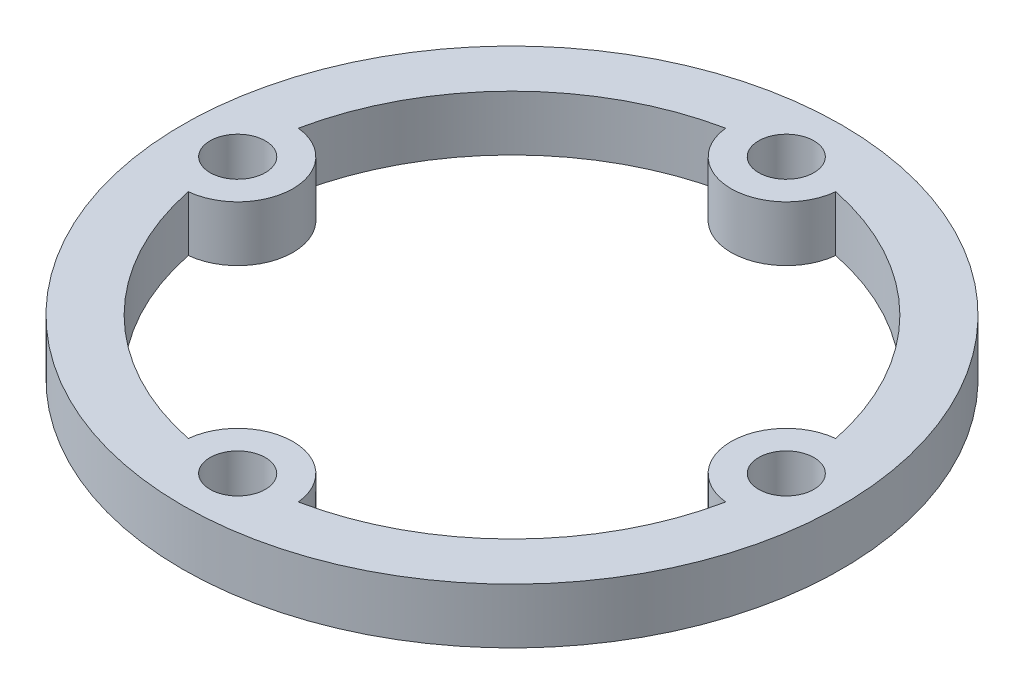
ISO-10303-21;
HEADER;
FILE_DESCRIPTION(('STEP AP214'),'2;1');
FILE_NAME('part.step','',(''),(''),'','','');
FILE_SCHEMA(('AUTOMOTIVE_DESIGN { 1 0 10303 214 1 1 1 1 }'));
ENDSEC;
DATA;
#1=APPLICATION_CONTEXT('core data for automotive mechanical design processes');
#2=APPLICATION_PROTOCOL_DEFINITION('international standard','automotive_design',2000,#1);
#3=PRODUCT_CONTEXT('',#1,'mechanical');
#4=PRODUCT('Part','Part','',(#3));
#5=PRODUCT_RELATED_PRODUCT_CATEGORY('part','',(#4));
#6=PRODUCT_DEFINITION_FORMATION('','',#4);
#7=PRODUCT_DEFINITION_CONTEXT('part definition',#1,'design');
#8=PRODUCT_DEFINITION('design','',#6,#7);
#9=PRODUCT_DEFINITION_SHAPE('','',#8);
#10=(LENGTH_UNIT() NAMED_UNIT(*) SI_UNIT(.MILLI.,.METRE.));
#11=(NAMED_UNIT(*) PLANE_ANGLE_UNIT() SI_UNIT($,.RADIAN.));
#12=(NAMED_UNIT(*) SI_UNIT($,.STERADIAN.) SOLID_ANGLE_UNIT());
#13=UNCERTAINTY_MEASURE_WITH_UNIT(LENGTH_MEASURE(1.E-05),#10,'distance_accuracy_value','');
#14=(GEOMETRIC_REPRESENTATION_CONTEXT(3) GLOBAL_UNCERTAINTY_ASSIGNED_CONTEXT((#13)) GLOBAL_UNIT_ASSIGNED_CONTEXT((#10,
#11,#12)) REPRESENTATION_CONTEXT('',''));
#15=CARTESIAN_POINT('',(0.,0.,0.));
#16=DIRECTION('',(0.,0.,1.));
#17=DIRECTION('',(1.,0.,0.));
#18=AXIS2_PLACEMENT_3D('',#15,#16,#17);
#19=CARTESIAN_POINT('',(0.,2.,-9.925));
#20=DIRECTION('',(0.,-1.,0.));
#21=DIRECTION('',(0.,0.,-1.));
#22=AXIS2_PLACEMENT_3D('',#19,#20,#21);
#23=CYLINDRICAL_SURFACE('',#22,2.);
#24=CARTESIAN_POINT('',(0.,0.,-9.925));
#25=DIRECTION('',(0.,1.,0.));
#26=DIRECTION('',(0.,0.,1.));
#27=AXIS2_PLACEMENT_3D('',#24,#25,#26);
#28=CIRCLE('',#27,2.);
#29=CARTESIAN_POINT('',(-1.98982239957777,0.,-9.72348866498741));
#30=VERTEX_POINT('',#29);
#31=CARTESIAN_POINT('',(1.98982239957777,0.,-9.72348866498741));
#32=VERTEX_POINT('',#31);
#33=EDGE_CURVE('E170',#30,#32,#28,.T.);
#34=ORIENTED_EDGE('',*,*,#33,.T.);
#35=DIRECTION('',(0.,-1.,0.));
#36=VECTOR('',#35,1.);
#37=CARTESIAN_POINT('',(1.98982239957777,2.,-9.72348866498741));
#38=LINE('',#37,#36);
#39=CARTESIAN_POINT('',(1.98982239957777,2.,-9.72348866498741));
#40=VERTEX_POINT('',#39);
#41=EDGE_CURVE('E11',#40,#32,#38,.T.);
#42=ORIENTED_EDGE('',*,*,#41,.F.);
#43=CARTESIAN_POINT('',(0.,2.,-9.925));
#44=DIRECTION('',(0.,1.,0.));
#45=DIRECTION('',(0.,0.,1.));
#46=AXIS2_PLACEMENT_3D('',#43,#44,#45);
#47=CIRCLE('',#46,2.);
#48=CARTESIAN_POINT('',(-1.98982239957777,2.,-9.72348866498741));
#49=VERTEX_POINT('',#48);
#50=EDGE_CURVE('E101',#49,#40,#47,.T.);
#51=ORIENTED_EDGE('',*,*,#50,.F.);
#52=DIRECTION('',(0.,-1.,0.));
#53=VECTOR('',#52,1.);
#54=CARTESIAN_POINT('',(-1.98982239957777,2.,-9.72348866498741));
#55=LINE('',#54,#53);
#56=EDGE_CURVE('E63',#49,#30,#55,.T.);
#57=ORIENTED_EDGE('',*,*,#56,.T.);
#58=EDGE_LOOP('',(#34,#42,#51,#57));
#59=FACE_BOUND('',#58,.T.);
#60=ADVANCED_FACE('F45',(#59),#23,.T.);
#61=CARTESIAN_POINT('',(0.,2.,0.));
#62=DIRECTION('',(0.,-1.,0.));
#63=DIRECTION('',(0.,0.,-1.));
#64=AXIS2_PLACEMENT_3D('',#61,#62,#63);
#65=CYLINDRICAL_SURFACE('',#64,9.925);
#66=CARTESIAN_POINT('',(0.,0.,0.));
#67=DIRECTION('',(0.,1.,0.));
#68=DIRECTION('',(0.,0.,1.));
#69=AXIS2_PLACEMENT_3D('',#66,#67,#68);
#70=CIRCLE('',#69,9.925);
#71=CARTESIAN_POINT('',(9.72348866498741,0.,-1.98982239957773));
#72=VERTEX_POINT('',#71);
#73=EDGE_CURVE('E173',#72,#32,#70,.T.);
#74=ORIENTED_EDGE('',*,*,#73,.F.);
#75=DIRECTION('',(0.,-1.,0.));
#76=VECTOR('',#75,1.);
#77=CARTESIAN_POINT('',(9.72348866498741,2.,-1.98982239957773));
#78=LINE('',#77,#76);
#79=CARTESIAN_POINT('',(9.72348866498741,2.,-1.98982239957773));
#80=VERTEX_POINT('',#79);
#81=EDGE_CURVE('E55',#80,#72,#78,.T.);
#82=ORIENTED_EDGE('',*,*,#81,.F.);
#83=CARTESIAN_POINT('',(0.,2.,0.));
#84=DIRECTION('',(0.,1.,0.));
#85=DIRECTION('',(0.,0.,1.));
#86=AXIS2_PLACEMENT_3D('',#83,#84,#85);
#87=CIRCLE('',#86,9.925);
#88=EDGE_CURVE('E238',#80,#40,#87,.T.);
#89=ORIENTED_EDGE('',*,*,#88,.T.);
#90=ORIENTED_EDGE('',*,*,#41,.T.);
#91=EDGE_LOOP('',(#74,#82,#89,#90));
#92=FACE_BOUND('',#91,.T.);
#93=ADVANCED_FACE('F237',(#92),#65,.F.);
#94=CARTESIAN_POINT('',(9.925,2.,0.));
#95=DIRECTION('',(0.,-1.,0.));
#96=DIRECTION('',(0.,0.,-1.));
#97=AXIS2_PLACEMENT_3D('',#94,#95,#96);
#98=CYLINDRICAL_SURFACE('',#97,2.);
#99=CARTESIAN_POINT('',(9.925,0.,0.));
#100=DIRECTION('',(0.,1.,0.));
#101=DIRECTION('',(0.,0.,1.));
#102=AXIS2_PLACEMENT_3D('',#99,#100,#101);
#103=CIRCLE('',#102,2.);
#104=CARTESIAN_POINT('',(9.7234886649874,0.,1.9898223995778));
#105=VERTEX_POINT('',#104);
#106=EDGE_CURVE('E177',#72,#105,#103,.T.);
#107=ORIENTED_EDGE('',*,*,#106,.T.);
#108=DIRECTION('',(0.,-1.,0.));
#109=VECTOR('',#108,1.);
#110=CARTESIAN_POINT('',(9.7234886649874,2.,1.9898223995778));
#111=LINE('',#110,#109);
#112=CARTESIAN_POINT('',(9.7234886649874,2.,1.9898223995778));
#113=VERTEX_POINT('',#112);
#114=EDGE_CURVE('E220',#113,#105,#111,.T.);
#115=ORIENTED_EDGE('',*,*,#114,.F.);
#116=CARTESIAN_POINT('',(9.925,2.,0.));
#117=DIRECTION('',(0.,1.,0.));
#118=DIRECTION('',(0.,0.,1.));
#119=AXIS2_PLACEMENT_3D('',#116,#117,#118);
#120=CIRCLE('',#119,2.);
#121=EDGE_CURVE('E228',#80,#113,#120,.T.);
#122=ORIENTED_EDGE('',*,*,#121,.F.);
#123=ORIENTED_EDGE('',*,*,#81,.T.);
#124=EDGE_LOOP('',(#107,#115,#122,#123));
#125=FACE_BOUND('',#124,.T.);
#126=ADVANCED_FACE('F226',(#125),#98,.T.);
#127=CARTESIAN_POINT('',(0.,2.,0.));
#128=DIRECTION('',(0.,-1.,0.));
#129=DIRECTION('',(0.,0.,-1.));
#130=AXIS2_PLACEMENT_3D('',#127,#128,#129);
#131=CYLINDRICAL_SURFACE('',#130,9.925);
#132=CARTESIAN_POINT('',(0.,0.,0.));
#133=DIRECTION('',(0.,1.,0.));
#134=DIRECTION('',(0.,0.,1.));
#135=AXIS2_PLACEMENT_3D('',#132,#133,#134);
#136=CIRCLE('',#135,9.925);
#137=CARTESIAN_POINT('',(1.9898223995777,0.,9.72348866498742));
#138=VERTEX_POINT('',#137);
#139=EDGE_CURVE('E181',#138,#105,#136,.T.);
#140=ORIENTED_EDGE('',*,*,#139,.F.);
#141=DIRECTION('',(0.,-1.,0.));
#142=VECTOR('',#141,1.);
#143=CARTESIAN_POINT('',(1.9898223995777,2.,9.72348866498742));
#144=LINE('',#143,#142);
#145=CARTESIAN_POINT('',(1.9898223995777,2.,9.72348866498742));
#146=VERTEX_POINT('',#145);
#147=EDGE_CURVE('E217',#146,#138,#144,.T.);
#148=ORIENTED_EDGE('',*,*,#147,.F.);
#149=CARTESIAN_POINT('',(0.,2.,0.));
#150=DIRECTION('',(0.,1.,0.));
#151=DIRECTION('',(0.,0.,1.));
#152=AXIS2_PLACEMENT_3D('',#149,#150,#151);
#153=CIRCLE('',#152,9.925);
#154=EDGE_CURVE('E144',#146,#113,#153,.T.);
#155=ORIENTED_EDGE('',*,*,#154,.T.);
#156=ORIENTED_EDGE('',*,*,#114,.T.);
#157=EDGE_LOOP('',(#140,#148,#155,#156));
#158=FACE_BOUND('',#157,.T.);
#159=ADVANCED_FACE('F262',(#158),#131,.F.);
#160=CARTESIAN_POINT('',(0.,2.,9.925));
#161=DIRECTION('',(0.,-1.,0.));
#162=DIRECTION('',(0.,0.,-1.));
#163=AXIS2_PLACEMENT_3D('',#160,#161,#162);
#164=CYLINDRICAL_SURFACE('',#163,2.);
#165=CARTESIAN_POINT('',(0.,0.,9.925));
#166=DIRECTION('',(0.,1.,0.));
#167=DIRECTION('',(0.,0.,1.));
#168=AXIS2_PLACEMENT_3D('',#165,#166,#167);
#169=CIRCLE('',#168,2.);
#170=CARTESIAN_POINT('',(-1.98982239957784,0.,9.72348866498739));
#171=VERTEX_POINT('',#170);
#172=EDGE_CURVE('E185',#138,#171,#169,.T.);
#173=ORIENTED_EDGE('',*,*,#172,.T.);
#174=DIRECTION('',(0.,-1.,0.));
#175=VECTOR('',#174,1.);
#176=CARTESIAN_POINT('',(-1.98982239957784,2.,9.72348866498739));
#177=LINE('',#176,#175);
#178=CARTESIAN_POINT('',(-1.98982239957784,2.,9.72348866498739));
#179=VERTEX_POINT('',#178);
#180=EDGE_CURVE('E128',#179,#171,#177,.T.);
#181=ORIENTED_EDGE('',*,*,#180,.F.);
#182=CARTESIAN_POINT('',(0.,2.,9.925));
#183=DIRECTION('',(0.,1.,0.));
#184=DIRECTION('',(0.,0.,1.));
#185=AXIS2_PLACEMENT_3D('',#182,#183,#184);
#186=CIRCLE('',#185,2.);
#187=EDGE_CURVE('E139',#146,#179,#186,.T.);
#188=ORIENTED_EDGE('',*,*,#187,.F.);
#189=ORIENTED_EDGE('',*,*,#147,.T.);
#190=EDGE_LOOP('',(#173,#181,#188,#189));
#191=FACE_BOUND('',#190,.T.);
#192=ADVANCED_FACE('F265',(#191),#164,.T.);
#193=CARTESIAN_POINT('',(0.,2.,0.));
#194=DIRECTION('',(0.,-1.,0.));
#195=DIRECTION('',(0.,0.,-1.));
#196=AXIS2_PLACEMENT_3D('',#193,#194,#195);
#197=CYLINDRICAL_SURFACE('',#196,9.925);
#198=CARTESIAN_POINT('',(0.,0.,0.));
#199=DIRECTION('',(0.,1.,0.));
#200=DIRECTION('',(0.,0.,1.));
#201=AXIS2_PLACEMENT_3D('',#198,#199,#200);
#202=CIRCLE('',#201,9.925);
#203=CARTESIAN_POINT('',(-9.72348866498743,0.,1.98982239957767));
#204=VERTEX_POINT('',#203);
#205=EDGE_CURVE('E124',#204,#171,#202,.T.);
#206=ORIENTED_EDGE('',*,*,#205,.F.);
#207=DIRECTION('',(0.,-1.,0.));
#208=VECTOR('',#207,1.);
#209=CARTESIAN_POINT('',(-9.72348866498743,2.,1.98982239957767));
#210=LINE('',#209,#208);
#211=CARTESIAN_POINT('',(-9.72348866498743,2.,1.98982239957767));
#212=VERTEX_POINT('',#211);
#213=EDGE_CURVE('E118',#212,#204,#210,.T.);
#214=ORIENTED_EDGE('',*,*,#213,.F.);
#215=CARTESIAN_POINT('',(0.,2.,0.));
#216=DIRECTION('',(0.,1.,0.));
#217=DIRECTION('',(0.,0.,1.));
#218=AXIS2_PLACEMENT_3D('',#215,#216,#217);
#219=CIRCLE('',#218,9.925);
#220=EDGE_CURVE('E122',#212,#179,#219,.T.);
#221=ORIENTED_EDGE('',*,*,#220,.T.);
#222=ORIENTED_EDGE('',*,*,#180,.T.);
#223=EDGE_LOOP('',(#206,#214,#221,#222));
#224=FACE_BOUND('',#223,.T.);
#225=ADVANCED_FACE('F120',(#224),#197,.F.);
#226=CARTESIAN_POINT('',(-9.925,2.,-1.03958856864054E-13));
#227=DIRECTION('',(0.,-1.,0.));
#228=DIRECTION('',(0.,0.,-1.));
#229=AXIS2_PLACEMENT_3D('',#226,#227,#228);
#230=CYLINDRICAL_SURFACE('',#229,2.);
#231=CARTESIAN_POINT('',(-9.925,0.,-1.03958856864054E-13));
#232=DIRECTION('',(0.,1.,0.));
#233=DIRECTION('',(0.,0.,1.));
#234=AXIS2_PLACEMENT_3D('',#231,#232,#233);
#235=CIRCLE('',#234,2.);
#236=CARTESIAN_POINT('',(-9.72348866498739,0.,-1.98982239957787));
#237=VERTEX_POINT('',#236);
#238=EDGE_CURVE('E191',#204,#237,#235,.T.);
#239=ORIENTED_EDGE('',*,*,#238,.T.);
#240=DIRECTION('',(0.,-1.,0.));
#241=VECTOR('',#240,1.);
#242=CARTESIAN_POINT('',(-9.72348866498739,2.,-1.98982239957787));
#243=LINE('',#242,#241);
#244=CARTESIAN_POINT('',(-9.72348866498739,2.,-1.98982239957787));
#245=VERTEX_POINT('',#244);
#246=EDGE_CURVE('E89',#245,#237,#243,.T.);
#247=ORIENTED_EDGE('',*,*,#246,.F.);
#248=CARTESIAN_POINT('',(-9.925,2.,-1.03958856864054E-13));
#249=DIRECTION('',(0.,1.,0.));
#250=DIRECTION('',(0.,0.,1.));
#251=AXIS2_PLACEMENT_3D('',#248,#249,#250);
#252=CIRCLE('',#251,2.);
#253=EDGE_CURVE('E130',#212,#245,#252,.T.);
#254=ORIENTED_EDGE('',*,*,#253,.F.);
#255=ORIENTED_EDGE('',*,*,#213,.T.);
#256=EDGE_LOOP('',(#239,#247,#254,#255));
#257=FACE_BOUND('',#256,.T.);
#258=ADVANCED_FACE('F131',(#257),#230,.T.);
#259=CARTESIAN_POINT('',(9.925,2.,0.));
#260=DIRECTION('',(0.,-1.,0.));
#261=DIRECTION('',(0.,0.,-1.));
#262=AXIS2_PLACEMENT_3D('',#259,#260,#261);
#263=CYLINDRICAL_SURFACE('',#262,1.);
#264=CARTESIAN_POINT('',(9.925,2.,0.));
#265=DIRECTION('',(0.,1.,0.));
#266=DIRECTION('',(0.,0.,1.));
#267=AXIS2_PLACEMENT_3D('',#264,#265,#266);
#268=CIRCLE('',#267,1.);
#269=CARTESIAN_POINT('',(9.925,2.,1.00000000000003));
#270=VERTEX_POINT('',#269);
#271=EDGE_CURVE('E154',#270,#270,#268,.T.);
#272=ORIENTED_EDGE('',*,*,#271,.T.);
#273=EDGE_LOOP('',(#272));
#274=FACE_BOUND('',#273,.T.);
#275=CARTESIAN_POINT('',(9.925,0.,0.));
#276=DIRECTION('',(0.,1.,0.));
#277=DIRECTION('',(0.,0.,1.));
#278=AXIS2_PLACEMENT_3D('',#275,#276,#277);
#279=CIRCLE('',#278,1.);
#280=CARTESIAN_POINT('',(9.925,0.,1.00000000000003));
#281=VERTEX_POINT('',#280);
#282=EDGE_CURVE('E202',#281,#281,#279,.T.);
#283=ORIENTED_EDGE('',*,*,#282,.F.);
#284=EDGE_LOOP('',(#283));
#285=FACE_BOUND('',#284,.T.);
#286=ADVANCED_FACE('F249',(#274,#285),#263,.F.);
#287=CARTESIAN_POINT('',(-9.925,2.,-1.03958856864054E-13));
#288=DIRECTION('',(0.,-1.,0.));
#289=DIRECTION('',(0.,0.,-1.));
#290=AXIS2_PLACEMENT_3D('',#287,#288,#289);
#291=CYLINDRICAL_SURFACE('',#290,1.);
#292=CARTESIAN_POINT('',(-9.925,2.,-1.03958856864054E-13));
#293=DIRECTION('',(0.,1.,0.));
#294=DIRECTION('',(0.,0.,1.));
#295=AXIS2_PLACEMENT_3D('',#292,#293,#294);
#296=CIRCLE('',#295,1.);
#297=CARTESIAN_POINT('',(-9.925,2.,0.999999999999896));
#298=VERTEX_POINT('',#297);
#299=EDGE_CURVE('E150',#298,#298,#296,.T.);
#300=ORIENTED_EDGE('',*,*,#299,.T.);
#301=EDGE_LOOP('',(#300));
#302=FACE_BOUND('',#301,.T.);
#303=CARTESIAN_POINT('',(-9.925,0.,-1.03958856864054E-13));
#304=DIRECTION('',(0.,1.,0.));
#305=DIRECTION('',(0.,0.,1.));
#306=AXIS2_PLACEMENT_3D('',#303,#304,#305);
#307=CIRCLE('',#306,1.);
#308=CARTESIAN_POINT('',(-9.925,0.,0.999999999999896));
#309=VERTEX_POINT('',#308);
#310=EDGE_CURVE('E198',#309,#309,#307,.T.);
#311=ORIENTED_EDGE('',*,*,#310,.F.);
#312=EDGE_LOOP('',(#311));
#313=FACE_BOUND('',#312,.T.);
#314=ADVANCED_FACE('F242',(#302,#313),#291,.F.);
#315=CARTESIAN_POINT('',(0.,2.,0.));
#316=DIRECTION('',(0.,-1.,0.));
#317=DIRECTION('',(0.,0.,-1.));
#318=AXIS2_PLACEMENT_3D('',#315,#316,#317);
#319=CYLINDRICAL_SURFACE('',#318,9.925);
#320=CARTESIAN_POINT('',(0.,0.,0.));
#321=DIRECTION('',(0.,1.,0.));
#322=DIRECTION('',(0.,0.,1.));
#323=AXIS2_PLACEMENT_3D('',#320,#321,#322);
#324=CIRCLE('',#323,9.925);
#325=EDGE_CURVE('E194',#30,#237,#324,.T.);
#326=ORIENTED_EDGE('',*,*,#325,.F.);
#327=ORIENTED_EDGE('',*,*,#56,.F.);
#328=CARTESIAN_POINT('',(0.,2.,0.));
#329=DIRECTION('',(0.,1.,0.));
#330=DIRECTION('',(0.,0.,1.));
#331=AXIS2_PLACEMENT_3D('',#328,#329,#330);
#332=CIRCLE('',#331,9.925);
#333=EDGE_CURVE('E133',#49,#245,#332,.T.);
#334=ORIENTED_EDGE('',*,*,#333,.T.);
#335=ORIENTED_EDGE('',*,*,#246,.T.);
#336=EDGE_LOOP('',(#326,#327,#334,#335));
#337=FACE_BOUND('',#336,.T.);
#338=ADVANCED_FACE('F239',(#337),#319,.F.);
#339=CARTESIAN_POINT('',(0.,2.,0.));
#340=DIRECTION('',(0.,-1.,0.));
#341=DIRECTION('',(0.,0.,-1.));
#342=AXIS2_PLACEMENT_3D('',#339,#340,#341);
#343=CYLINDRICAL_SURFACE('',#342,11.925);
#344=CARTESIAN_POINT('',(0.,2.,0.));
#345=DIRECTION('',(0.,1.,0.));
#346=DIRECTION('',(0.,0.,1.));
#347=AXIS2_PLACEMENT_3D('',#344,#345,#346);
#348=CIRCLE('',#347,11.925);
#349=CARTESIAN_POINT('',(0.,2.,11.925));
#350=VERTEX_POINT('',#349);
#351=EDGE_CURVE('E297',#350,#350,#348,.T.);
#352=ORIENTED_EDGE('',*,*,#351,.F.);
#353=EDGE_LOOP('',(#352));
#354=FACE_BOUND('',#353,.T.);
#355=CARTESIAN_POINT('',(0.,0.,0.));
#356=DIRECTION('',(0.,1.,0.));
#357=DIRECTION('',(0.,0.,1.));
#358=AXIS2_PLACEMENT_3D('',#355,#356,#357);
#359=CIRCLE('',#358,11.925);
#360=CARTESIAN_POINT('',(0.,0.,11.925));
#361=VERTEX_POINT('',#360);
#362=EDGE_CURVE('E166',#361,#361,#359,.T.);
#363=ORIENTED_EDGE('',*,*,#362,.T.);
#364=EDGE_LOOP('',(#363));
#365=FACE_BOUND('',#364,.T.);
#366=ADVANCED_FACE('F241',(#354,#365),#343,.T.);
#367=CARTESIAN_POINT('',(0.,2.,-9.925));
#368=DIRECTION('',(0.,-1.,0.));
#369=DIRECTION('',(0.,0.,-1.));
#370=AXIS2_PLACEMENT_3D('',#367,#368,#369);
#371=CYLINDRICAL_SURFACE('',#370,1.);
#372=CARTESIAN_POINT('',(0.,2.,-9.925));
#373=DIRECTION('',(0.,1.,0.));
#374=DIRECTION('',(0.,0.,1.));
#375=AXIS2_PLACEMENT_3D('',#372,#373,#374);
#376=CIRCLE('',#375,1.);
#377=CARTESIAN_POINT('',(0.,2.,-8.925));
#378=VERTEX_POINT('',#377);
#379=EDGE_CURVE('E210',#378,#378,#376,.T.);
#380=ORIENTED_EDGE('',*,*,#379,.T.);
#381=EDGE_LOOP('',(#380));
#382=FACE_BOUND('',#381,.T.);
#383=CARTESIAN_POINT('',(0.,0.,-9.925));
#384=DIRECTION('',(0.,1.,0.));
#385=DIRECTION('',(0.,0.,1.));
#386=AXIS2_PLACEMENT_3D('',#383,#384,#385);
#387=CIRCLE('',#386,1.);
#388=CARTESIAN_POINT('',(0.,0.,-8.925));
#389=VERTEX_POINT('',#388);
#390=EDGE_CURVE('E162',#389,#389,#387,.T.);
#391=ORIENTED_EDGE('',*,*,#390,.F.);
#392=EDGE_LOOP('',(#391));
#393=FACE_BOUND('',#392,.T.);
#394=ADVANCED_FACE('F47',(#382,#393),#371,.F.);
#395=CARTESIAN_POINT('',(0.,2.,9.925));
#396=DIRECTION('',(0.,-1.,0.));
#397=DIRECTION('',(0.,0.,-1.));
#398=AXIS2_PLACEMENT_3D('',#395,#396,#397);
#399=CYLINDRICAL_SURFACE('',#398,1.);
#400=CARTESIAN_POINT('',(0.,2.,9.925));
#401=DIRECTION('',(0.,1.,0.));
#402=DIRECTION('',(0.,0.,1.));
#403=AXIS2_PLACEMENT_3D('',#400,#401,#402);
#404=CIRCLE('',#403,1.);
#405=CARTESIAN_POINT('',(0.,2.,10.925));
#406=VERTEX_POINT('',#405);
#407=EDGE_CURVE('E158',#406,#406,#404,.T.);
#408=ORIENTED_EDGE('',*,*,#407,.T.);
#409=EDGE_LOOP('',(#408));
#410=FACE_BOUND('',#409,.T.);
#411=CARTESIAN_POINT('',(0.,0.,9.925));
#412=DIRECTION('',(0.,1.,0.));
#413=DIRECTION('',(0.,0.,1.));
#414=AXIS2_PLACEMENT_3D('',#411,#412,#413);
#415=CIRCLE('',#414,1.);
#416=CARTESIAN_POINT('',(0.,0.,10.925));
#417=VERTEX_POINT('',#416);
#418=EDGE_CURVE('E206',#417,#417,#415,.T.);
#419=ORIENTED_EDGE('',*,*,#418,.F.);
#420=EDGE_LOOP('',(#419));
#421=FACE_BOUND('',#420,.T.);
#422=ADVANCED_FACE('F281',(#410,#421),#399,.F.);
#423=CARTESIAN_POINT('',(0.,2.,0.));
#424=DIRECTION('',(0.,1.,0.));
#425=DIRECTION('',(0.,0.,1.));
#426=AXIS2_PLACEMENT_3D('',#423,#424,#425);
#427=PLANE('',#426);
#428=ORIENTED_EDGE('',*,*,#379,.F.);
#429=EDGE_LOOP('',(#428));
#430=FACE_BOUND('',#429,.T.);
#431=ORIENTED_EDGE('',*,*,#351,.T.);
#432=EDGE_LOOP('',(#431));
#433=FACE_BOUND('',#432,.T.);
#434=ORIENTED_EDGE('',*,*,#50,.T.);
#435=ORIENTED_EDGE('',*,*,#88,.F.);
#436=ORIENTED_EDGE('',*,*,#121,.T.);
#437=ORIENTED_EDGE('',*,*,#154,.F.);
#438=ORIENTED_EDGE('',*,*,#187,.T.);
#439=ORIENTED_EDGE('',*,*,#220,.F.);
#440=ORIENTED_EDGE('',*,*,#253,.T.);
#441=ORIENTED_EDGE('',*,*,#333,.F.);
#442=EDGE_LOOP('',(#434,#435,#436,#437,#438,#439,#440,#441));
#443=FACE_BOUND('',#442,.T.);
#444=ORIENTED_EDGE('',*,*,#299,.F.);
#445=EDGE_LOOP('',(#444));
#446=FACE_BOUND('',#445,.T.);
#447=ORIENTED_EDGE('',*,*,#271,.F.);
#448=EDGE_LOOP('',(#447));
#449=FACE_BOUND('',#448,.T.);
#450=ORIENTED_EDGE('',*,*,#407,.F.);
#451=EDGE_LOOP('',(#450));
#452=FACE_BOUND('',#451,.T.);
#453=ADVANCED_FACE('F135',(#430,#433,#443,#446,#449,#452),#427,.T.);
#454=CARTESIAN_POINT('',(0.,0.,0.));
#455=DIRECTION('',(0.,1.,0.));
#456=DIRECTION('',(0.,0.,1.));
#457=AXIS2_PLACEMENT_3D('',#454,#455,#456);
#458=PLANE('',#457);
#459=ORIENTED_EDGE('',*,*,#390,.T.);
#460=EDGE_LOOP('',(#459));
#461=FACE_BOUND('',#460,.T.);
#462=ORIENTED_EDGE('',*,*,#362,.F.);
#463=EDGE_LOOP('',(#462));
#464=FACE_BOUND('',#463,.T.);
#465=ORIENTED_EDGE('',*,*,#33,.F.);
#466=ORIENTED_EDGE('',*,*,#325,.T.);
#467=ORIENTED_EDGE('',*,*,#238,.F.);
#468=ORIENTED_EDGE('',*,*,#205,.T.);
#469=ORIENTED_EDGE('',*,*,#172,.F.);
#470=ORIENTED_EDGE('',*,*,#139,.T.);
#471=ORIENTED_EDGE('',*,*,#106,.F.);
#472=ORIENTED_EDGE('',*,*,#73,.T.);
#473=EDGE_LOOP('',(#465,#466,#467,#468,#469,#470,#471,#472));
#474=FACE_BOUND('',#473,.T.);
#475=ORIENTED_EDGE('',*,*,#310,.T.);
#476=EDGE_LOOP('',(#475));
#477=FACE_BOUND('',#476,.T.);
#478=ORIENTED_EDGE('',*,*,#282,.T.);
#479=EDGE_LOOP('',(#478));
#480=FACE_BOUND('',#479,.T.);
#481=ORIENTED_EDGE('',*,*,#418,.T.);
#482=EDGE_LOOP('',(#481));
#483=FACE_BOUND('',#482,.T.);
#484=ADVANCED_FACE('F233',(#461,#464,#474,#477,#480,#483),#458,.F.);
#485=CLOSED_SHELL('',(#60,#93,#126,#159,#192,#225,#258,#286,#314,#338,#366,#394,#422,#453,#484));
#486=MANIFOLD_SOLID_BREP('B2',#485);
#487=ADVANCED_BREP_SHAPE_REPRESENTATION('',(#18,#486),#14);
#488=SHAPE_DEFINITION_REPRESENTATION(#9,#487);
ENDSEC;
END-ISO-10303-21;
